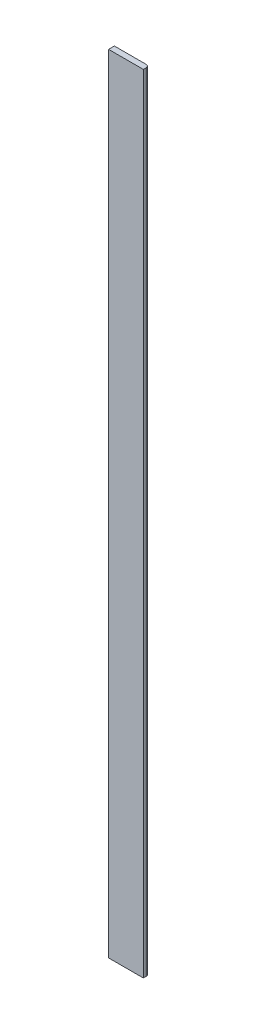
ISO-10303-21;
HEADER;
FILE_DESCRIPTION(('STEP AP214'),'2;1');
FILE_NAME('part.step','',(''),(''),'','','');
FILE_SCHEMA(('AUTOMOTIVE_DESIGN { 1 0 10303 214 1 1 1 1 }'));
ENDSEC;
DATA;
#1=APPLICATION_CONTEXT('core data for automotive mechanical design processes');
#2=APPLICATION_PROTOCOL_DEFINITION('international standard','automotive_design',2000,#1);
#3=PRODUCT_CONTEXT('',#1,'mechanical');
#4=PRODUCT('Part','Part','',(#3));
#5=PRODUCT_RELATED_PRODUCT_CATEGORY('part','',(#4));
#6=PRODUCT_DEFINITION_FORMATION('','',#4);
#7=PRODUCT_DEFINITION_CONTEXT('part definition',#1,'design');
#8=PRODUCT_DEFINITION('design','',#6,#7);
#9=PRODUCT_DEFINITION_SHAPE('','',#8);
#10=(LENGTH_UNIT() NAMED_UNIT(*) SI_UNIT(.MILLI.,.METRE.));
#11=(NAMED_UNIT(*) PLANE_ANGLE_UNIT() SI_UNIT($,.RADIAN.));
#12=(NAMED_UNIT(*) SI_UNIT($,.STERADIAN.) SOLID_ANGLE_UNIT());
#13=UNCERTAINTY_MEASURE_WITH_UNIT(LENGTH_MEASURE(1.E-05),#10,'distance_accuracy_value','');
#14=(GEOMETRIC_REPRESENTATION_CONTEXT(3) GLOBAL_UNCERTAINTY_ASSIGNED_CONTEXT((#13)) GLOBAL_UNIT_ASSIGNED_CONTEXT((#10,
#11,#12)) REPRESENTATION_CONTEXT('',''));
#15=CARTESIAN_POINT('',(0.,0.,0.));
#16=DIRECTION('',(0.,0.,1.));
#17=DIRECTION('',(1.,0.,0.));
#18=AXIS2_PLACEMENT_3D('',#15,#16,#17);
#19=CARTESIAN_POINT('',(0.,431.8,0.));
#20=DIRECTION('',(1.,0.,0.));
#21=DIRECTION('',(0.,0.,-1.));
#22=AXIS2_PLACEMENT_3D('',#19,#20,#21);
#23=PLANE('',#22);
#24=DIRECTION('',(0.,-1.,0.));
#25=VECTOR('',#24,1.);
#26=CARTESIAN_POINT('',(0.,431.8,-3.175));
#27=LINE('',#26,#25);
#28=CARTESIAN_POINT('',(0.,431.8,-3.175));
#29=VERTEX_POINT('',#28);
#30=CARTESIAN_POINT('',(0.,406.4,-3.175));
#31=VERTEX_POINT('',#30);
#32=EDGE_CURVE('E198',#29,#31,#27,.T.);
#33=ORIENTED_EDGE('',*,*,#32,.T.);
#34=DIRECTION('',(0.,0.,-1.));
#35=VECTOR('',#34,1.);
#36=CARTESIAN_POINT('',(0.,406.4,0.));
#37=LINE('',#36,#35);
#38=CARTESIAN_POINT('',(0.,406.4,-19.05));
#39=VERTEX_POINT('',#38);
#40=EDGE_CURVE('E123',#31,#39,#37,.T.);
#41=ORIENTED_EDGE('',*,*,#40,.T.);
#42=DIRECTION('',(0.,-1.,0.));
#43=VECTOR('',#42,1.);
#44=CARTESIAN_POINT('',(0.,431.8,-19.05));
#45=LINE('',#44,#43);
#46=CARTESIAN_POINT('',(0.,0.,-19.05));
#47=VERTEX_POINT('',#46);
#48=EDGE_CURVE('E90',#39,#47,#45,.T.);
#49=ORIENTED_EDGE('',*,*,#48,.T.);
#50=DIRECTION('',(0.,0.,1.));
#51=VECTOR('',#50,1.);
#52=CARTESIAN_POINT('',(0.,0.,0.));
#53=LINE('',#52,#51);
#54=CARTESIAN_POINT('',(0.,0.,0.));
#55=VERTEX_POINT('',#54);
#56=EDGE_CURVE('E171',#47,#55,#53,.T.);
#57=ORIENTED_EDGE('',*,*,#56,.T.);
#58=DIRECTION('',(0.,-1.,0.));
#59=VECTOR('',#58,1.);
#60=CARTESIAN_POINT('',(0.,431.8,0.));
#61=LINE('',#60,#59);
#62=CARTESIAN_POINT('',(0.,431.8,0.));
#63=VERTEX_POINT('',#62);
#64=EDGE_CURVE('E11',#63,#55,#61,.T.);
#65=ORIENTED_EDGE('',*,*,#64,.F.);
#66=DIRECTION('',(0.,0.,1.));
#67=VECTOR('',#66,1.);
#68=CARTESIAN_POINT('',(0.,431.8,0.));
#69=LINE('',#68,#67);
#70=EDGE_CURVE('E95',#29,#63,#69,.T.);
#71=ORIENTED_EDGE('',*,*,#70,.F.);
#72=EDGE_LOOP('',(#33,#41,#49,#57,#65,#71));
#73=FACE_BOUND('',#72,.T.);
#74=ADVANCED_FACE('F33',(#73),#23,.F.);
#75=CARTESIAN_POINT('',(0.,431.8,0.));
#76=DIRECTION('',(0.,0.,-1.));
#77=DIRECTION('',(-1.,0.,0.));
#78=AXIS2_PLACEMENT_3D('',#75,#76,#77);
#79=PLANE('',#78);
#80=DIRECTION('',(1.,0.,0.));
#81=VECTOR('',#80,1.);
#82=CARTESIAN_POINT('',(0.,0.,0.));
#83=LINE('',#82,#81);
#84=CARTESIAN_POINT('',(19.05,0.,0.));
#85=VERTEX_POINT('',#84);
#86=EDGE_CURVE('E167',#55,#85,#83,.T.);
#87=ORIENTED_EDGE('',*,*,#86,.T.);
#88=DIRECTION('',(0.,-1.,0.));
#89=VECTOR('',#88,1.);
#90=CARTESIAN_POINT('',(19.05,431.8,0.));
#91=LINE('',#90,#89);
#92=CARTESIAN_POINT('',(19.05,431.8,0.));
#93=VERTEX_POINT('',#92);
#94=EDGE_CURVE('E41',#93,#85,#91,.T.);
#95=ORIENTED_EDGE('',*,*,#94,.F.);
#96=DIRECTION('',(1.,0.,0.));
#97=VECTOR('',#96,1.);
#98=CARTESIAN_POINT('',(0.,431.8,0.));
#99=LINE('',#98,#97);
#100=EDGE_CURVE('E206',#63,#93,#99,.T.);
#101=ORIENTED_EDGE('',*,*,#100,.F.);
#102=ORIENTED_EDGE('',*,*,#64,.T.);
#103=EDGE_LOOP('',(#87,#95,#101,#102));
#104=FACE_BOUND('',#103,.T.);
#105=ADVANCED_FACE('F211',(#104),#79,.F.);
#106=CARTESIAN_POINT('',(19.05,431.8,-1.58749999999999));
#107=DIRECTION('',(-1.,0.,0.));
#108=DIRECTION('',(0.,0.,1.));
#109=AXIS2_PLACEMENT_3D('',#106,#107,#108);
#110=PLANE('',#109);
#111=DIRECTION('',(0.,0.,-1.));
#112=VECTOR('',#111,1.);
#113=CARTESIAN_POINT('',(19.05,0.,-1.58749999999999));
#114=LINE('',#113,#112);
#115=CARTESIAN_POINT('',(19.05,0.,-1.58749999999999));
#116=VERTEX_POINT('',#115);
#117=EDGE_CURVE('E160',#85,#116,#114,.T.);
#118=ORIENTED_EDGE('',*,*,#117,.T.);
#119=DIRECTION('',(0.,-1.,0.));
#120=VECTOR('',#119,1.);
#121=CARTESIAN_POINT('',(19.05,431.8,-1.58749999999999));
#122=LINE('',#121,#120);
#123=CARTESIAN_POINT('',(19.05,431.8,-1.58749999999999));
#124=VERTEX_POINT('',#123);
#125=EDGE_CURVE('E146',#124,#116,#122,.T.);
#126=ORIENTED_EDGE('',*,*,#125,.F.);
#127=DIRECTION('',(0.,0.,-1.));
#128=VECTOR('',#127,1.);
#129=CARTESIAN_POINT('',(19.05,431.8,-1.58749999999999));
#130=LINE('',#129,#128);
#131=EDGE_CURVE('E161',#93,#124,#130,.T.);
#132=ORIENTED_EDGE('',*,*,#131,.F.);
#133=ORIENTED_EDGE('',*,*,#94,.T.);
#134=EDGE_LOOP('',(#118,#126,#132,#133));
#135=FACE_BOUND('',#134,.T.);
#136=ADVANCED_FACE('F158',(#135),#110,.F.);
#137=CARTESIAN_POINT('',(17.4625,431.8,-1.5875));
#138=DIRECTION('',(0.,-1.,0.));
#139=DIRECTION('',(0.,0.,-1.));
#140=AXIS2_PLACEMENT_3D('',#137,#138,#139);
#141=CYLINDRICAL_SURFACE('',#140,1.5875);
#142=CARTESIAN_POINT('',(17.4625,0.,-1.5875));
#143=DIRECTION('',(0.,1.,0.));
#144=DIRECTION('',(0.,0.,-1.));
#145=AXIS2_PLACEMENT_3D('',#142,#143,#144);
#146=CIRCLE('',#145,1.5875);
#147=CARTESIAN_POINT('',(17.4625,0.,-3.175));
#148=VERTEX_POINT('',#147);
#149=EDGE_CURVE('E168',#116,#148,#146,.T.);
#150=ORIENTED_EDGE('',*,*,#149,.T.);
#151=DIRECTION('',(0.,-1.,0.));
#152=VECTOR('',#151,1.);
#153=CARTESIAN_POINT('',(17.4625,431.8,-3.175));
#154=LINE('',#153,#152);
#155=CARTESIAN_POINT('',(17.4625,431.8,-3.175));
#156=VERTEX_POINT('',#155);
#157=EDGE_CURVE('E144',#156,#148,#154,.T.);
#158=ORIENTED_EDGE('',*,*,#157,.F.);
#159=CARTESIAN_POINT('',(17.4625,431.8,-1.5875));
#160=DIRECTION('',(0.,1.,0.));
#161=DIRECTION('',(0.,0.,-1.));
#162=AXIS2_PLACEMENT_3D('',#159,#160,#161);
#163=CIRCLE('',#162,1.5875);
#164=EDGE_CURVE('E49',#124,#156,#163,.T.);
#165=ORIENTED_EDGE('',*,*,#164,.F.);
#166=ORIENTED_EDGE('',*,*,#125,.T.);
#167=EDGE_LOOP('',(#150,#158,#165,#166));
#168=FACE_BOUND('',#167,.T.);
#169=ADVANCED_FACE('F214',(#168),#141,.T.);
#170=CARTESIAN_POINT('',(4.76250000000001,431.8,-3.175));
#171=DIRECTION('',(0.,0.,1.));
#172=DIRECTION('',(1.,0.,0.));
#173=AXIS2_PLACEMENT_3D('',#170,#171,#172);
#174=PLANE('',#173);
#175=DIRECTION('',(0.,-1.,0.));
#176=VECTOR('',#175,1.);
#177=CARTESIAN_POINT('',(4.76250000000001,431.8,-3.175));
#178=LINE('',#177,#176);
#179=CARTESIAN_POINT('',(4.7625,406.4,-3.175));
#180=VERTEX_POINT('',#179);
#181=CARTESIAN_POINT('',(4.76250000000001,0.,-3.175));
#182=VERTEX_POINT('',#181);
#183=EDGE_CURVE('E135',#180,#182,#178,.T.);
#184=ORIENTED_EDGE('',*,*,#183,.F.);
#185=DIRECTION('',(1.,0.,0.));
#186=VECTOR('',#185,1.);
#187=CARTESIAN_POINT('',(-3.175,406.4,-3.175));
#188=LINE('',#187,#186);
#189=EDGE_CURVE('E118',#31,#180,#188,.T.);
#190=ORIENTED_EDGE('',*,*,#189,.F.);
#191=ORIENTED_EDGE('',*,*,#32,.F.);
#192=DIRECTION('',(-1.,0.,0.));
#193=VECTOR('',#192,1.);
#194=CARTESIAN_POINT('',(4.76250000000001,431.8,-3.175));
#195=LINE('',#194,#193);
#196=EDGE_CURVE('E186',#156,#29,#195,.T.);
#197=ORIENTED_EDGE('',*,*,#196,.F.);
#198=ORIENTED_EDGE('',*,*,#157,.T.);
#199=DIRECTION('',(-1.,0.,0.));
#200=VECTOR('',#199,1.);
#201=CARTESIAN_POINT('',(4.76250000000001,0.,-3.175));
#202=LINE('',#201,#200);
#203=EDGE_CURVE('E142',#148,#182,#202,.T.);
#204=ORIENTED_EDGE('',*,*,#203,.T.);
#205=EDGE_LOOP('',(#184,#190,#191,#197,#198,#204));
#206=FACE_BOUND('',#205,.T.);
#207=ADVANCED_FACE('F139',(#206),#174,.F.);
#208=CARTESIAN_POINT('',(4.7625,431.8,-4.7625));
#209=DIRECTION('',(0.,-1.,0.));
#210=DIRECTION('',(0.,0.,-1.));
#211=AXIS2_PLACEMENT_3D('',#208,#209,#210);
#212=CYLINDRICAL_SURFACE('',#211,1.5875);
#213=DIRECTION('',(0.,-1.,0.));
#214=VECTOR('',#213,1.);
#215=CARTESIAN_POINT('',(3.175,431.8,-4.76250000000001));
#216=LINE('',#215,#214);
#217=CARTESIAN_POINT('',(3.175,406.4,-4.76250000000001));
#218=VERTEX_POINT('',#217);
#219=CARTESIAN_POINT('',(3.175,0.,-4.76250000000001));
#220=VERTEX_POINT('',#219);
#221=EDGE_CURVE('E137',#218,#220,#216,.T.);
#222=ORIENTED_EDGE('',*,*,#221,.F.);
#223=CARTESIAN_POINT('',(4.7625,406.4,-4.7625));
#224=DIRECTION('',(0.,-1.,0.));
#225=DIRECTION('',(0.,0.,-1.));
#226=AXIS2_PLACEMENT_3D('',#223,#224,#225);
#227=CIRCLE('',#226,1.5875);
#228=EDGE_CURVE('E121',#218,#180,#227,.F.);
#229=ORIENTED_EDGE('',*,*,#228,.T.);
#230=ORIENTED_EDGE('',*,*,#183,.T.);
#231=CARTESIAN_POINT('',(4.7625,0.,-4.7625));
#232=DIRECTION('',(0.,-1.,0.));
#233=DIRECTION('',(0.,0.,1.));
#234=AXIS2_PLACEMENT_3D('',#231,#232,#233);
#235=CIRCLE('',#234,1.5875);
#236=EDGE_CURVE('E176',#182,#220,#235,.T.);
#237=ORIENTED_EDGE('',*,*,#236,.T.);
#238=EDGE_LOOP('',(#222,#229,#230,#237));
#239=FACE_BOUND('',#238,.T.);
#240=ADVANCED_FACE('F133',(#239),#212,.F.);
#241=CARTESIAN_POINT('',(3.175,431.8,-4.76250000000001));
#242=DIRECTION('',(-1.,0.,0.));
#243=DIRECTION('',(0.,0.,1.));
#244=AXIS2_PLACEMENT_3D('',#241,#242,#243);
#245=PLANE('',#244);
#246=DIRECTION('',(0.,-1.,0.));
#247=VECTOR('',#246,1.);
#248=CARTESIAN_POINT('',(3.175,431.8,-17.4625));
#249=LINE('',#248,#247);
#250=CARTESIAN_POINT('',(3.175,406.4,-17.4625));
#251=VERTEX_POINT('',#250);
#252=CARTESIAN_POINT('',(3.175,0.,-17.4625));
#253=VERTEX_POINT('',#252);
#254=EDGE_CURVE('E148',#251,#253,#249,.T.);
#255=ORIENTED_EDGE('',*,*,#254,.F.);
#256=DIRECTION('',(0.,0.,-1.));
#257=VECTOR('',#256,1.);
#258=CARTESIAN_POINT('',(3.175,406.4,-19.05));
#259=LINE('',#258,#257);
#260=EDGE_CURVE('E129',#218,#251,#259,.T.);
#261=ORIENTED_EDGE('',*,*,#260,.F.);
#262=ORIENTED_EDGE('',*,*,#221,.T.);
#263=DIRECTION('',(0.,0.,-1.));
#264=VECTOR('',#263,1.);
#265=CARTESIAN_POINT('',(3.175,0.,-4.76250000000001));
#266=LINE('',#265,#264);
#267=EDGE_CURVE('E178',#220,#253,#266,.T.);
#268=ORIENTED_EDGE('',*,*,#267,.T.);
#269=EDGE_LOOP('',(#255,#261,#262,#268));
#270=FACE_BOUND('',#269,.T.);
#271=ADVANCED_FACE('F196',(#270),#245,.F.);
#272=CARTESIAN_POINT('',(1.5875,431.8,-17.4625));
#273=DIRECTION('',(0.,-1.,0.));
#274=DIRECTION('',(0.,0.,-1.));
#275=AXIS2_PLACEMENT_3D('',#272,#273,#274);
#276=CYLINDRICAL_SURFACE('',#275,1.5875);
#277=DIRECTION('',(0.,-1.,0.));
#278=VECTOR('',#277,1.);
#279=CARTESIAN_POINT('',(1.58749999999999,431.8,-19.05));
#280=LINE('',#279,#278);
#281=CARTESIAN_POINT('',(1.58749999999999,406.4,-19.05));
#282=VERTEX_POINT('',#281);
#283=CARTESIAN_POINT('',(1.58749999999999,0.,-19.05));
#284=VERTEX_POINT('',#283);
#285=EDGE_CURVE('E82',#282,#284,#280,.T.);
#286=ORIENTED_EDGE('',*,*,#285,.F.);
#287=CARTESIAN_POINT('',(1.5875,406.4,-17.4625));
#288=DIRECTION('',(0.,-1.,0.));
#289=DIRECTION('',(0.,0.,-1.));
#290=AXIS2_PLACEMENT_3D('',#287,#288,#289);
#291=CIRCLE('',#290,1.5875);
#292=EDGE_CURVE('E193',#282,#251,#291,.T.);
#293=ORIENTED_EDGE('',*,*,#292,.T.);
#294=ORIENTED_EDGE('',*,*,#254,.T.);
#295=CARTESIAN_POINT('',(1.5875,0.,-17.4625));
#296=DIRECTION('',(0.,1.,0.));
#297=DIRECTION('',(0.,0.,1.));
#298=AXIS2_PLACEMENT_3D('',#295,#296,#297);
#299=CIRCLE('',#298,1.5875);
#300=EDGE_CURVE('E181',#253,#284,#299,.T.);
#301=ORIENTED_EDGE('',*,*,#300,.T.);
#302=EDGE_LOOP('',(#286,#293,#294,#301));
#303=FACE_BOUND('',#302,.T.);
#304=ADVANCED_FACE('F190',(#303),#276,.T.);
#305=CARTESIAN_POINT('',(0.,431.8,-19.05));
#306=DIRECTION('',(0.,0.,1.));
#307=DIRECTION('',(1.,0.,0.));
#308=AXIS2_PLACEMENT_3D('',#305,#306,#307);
#309=PLANE('',#308);
#310=ORIENTED_EDGE('',*,*,#48,.F.);
#311=DIRECTION('',(1.,0.,0.));
#312=VECTOR('',#311,1.);
#313=CARTESIAN_POINT('',(-3.175,406.4,-19.05));
#314=LINE('',#313,#312);
#315=EDGE_CURVE('E128',#39,#282,#314,.T.);
#316=ORIENTED_EDGE('',*,*,#315,.T.);
#317=ORIENTED_EDGE('',*,*,#285,.T.);
#318=DIRECTION('',(-1.,0.,0.));
#319=VECTOR('',#318,1.);
#320=CARTESIAN_POINT('',(0.,0.,-19.05));
#321=LINE('',#320,#319);
#322=EDGE_CURVE('E183',#284,#47,#321,.T.);
#323=ORIENTED_EDGE('',*,*,#322,.T.);
#324=EDGE_LOOP('',(#310,#316,#317,#323));
#325=FACE_BOUND('',#324,.T.);
#326=ADVANCED_FACE('F197',(#325),#309,.F.);
#327=CARTESIAN_POINT('',(1.5875,431.8,-17.4625));
#328=DIRECTION('',(0.,1.,0.));
#329=DIRECTION('',(0.,0.,1.));
#330=AXIS2_PLACEMENT_3D('',#327,#328,#329);
#331=PLANE('',#330);
#332=ORIENTED_EDGE('',*,*,#196,.T.);
#333=ORIENTED_EDGE('',*,*,#70,.T.);
#334=ORIENTED_EDGE('',*,*,#100,.T.);
#335=ORIENTED_EDGE('',*,*,#131,.T.);
#336=ORIENTED_EDGE('',*,*,#164,.T.);
#337=EDGE_LOOP('',(#332,#333,#334,#335,#336));
#338=FACE_BOUND('',#337,.T.);
#339=ADVANCED_FACE('F212',(#338),#331,.T.);
#340=CARTESIAN_POINT('',(1.5875,0.,-17.4625));
#341=DIRECTION('',(0.,1.,0.));
#342=DIRECTION('',(0.,0.,1.));
#343=AXIS2_PLACEMENT_3D('',#340,#341,#342);
#344=PLANE('',#343);
#345=ORIENTED_EDGE('',*,*,#56,.F.);
#346=ORIENTED_EDGE('',*,*,#322,.F.);
#347=ORIENTED_EDGE('',*,*,#300,.F.);
#348=ORIENTED_EDGE('',*,*,#267,.F.);
#349=ORIENTED_EDGE('',*,*,#236,.F.);
#350=ORIENTED_EDGE('',*,*,#203,.F.);
#351=ORIENTED_EDGE('',*,*,#149,.F.);
#352=ORIENTED_EDGE('',*,*,#117,.F.);
#353=ORIENTED_EDGE('',*,*,#86,.F.);
#354=EDGE_LOOP('',(#345,#346,#347,#348,#349,#350,#351,#352,#353));
#355=FACE_BOUND('',#354,.T.);
#356=ADVANCED_FACE('F166',(#355),#344,.F.);
#357=CARTESIAN_POINT('',(-3.175,406.4,-19.05));
#358=DIRECTION('',(0.,-1.,0.));
#359=DIRECTION('',(0.,0.,-1.));
#360=AXIS2_PLACEMENT_3D('',#357,#358,#359);
#361=PLANE('',#360);
#362=ORIENTED_EDGE('',*,*,#189,.T.);
#363=ORIENTED_EDGE('',*,*,#228,.F.);
#364=ORIENTED_EDGE('',*,*,#260,.T.);
#365=ORIENTED_EDGE('',*,*,#292,.F.);
#366=ORIENTED_EDGE('',*,*,#315,.F.);
#367=ORIENTED_EDGE('',*,*,#40,.F.);
#368=EDGE_LOOP('',(#362,#363,#364,#365,#366,#367));
#369=FACE_BOUND('',#368,.T.);
#370=ADVANCED_FACE('F120',(#369),#361,.F.);
#371=CLOSED_SHELL('',(#74,#105,#136,#169,#207,#240,#271,#304,#326,#339,#356,#370));
#372=MANIFOLD_SOLID_BREP('B2',#371);
#373=ADVANCED_BREP_SHAPE_REPRESENTATION('',(#18,#372),#14);
#374=SHAPE_DEFINITION_REPRESENTATION(#9,#373);
ENDSEC;
END-ISO-10303-21;
